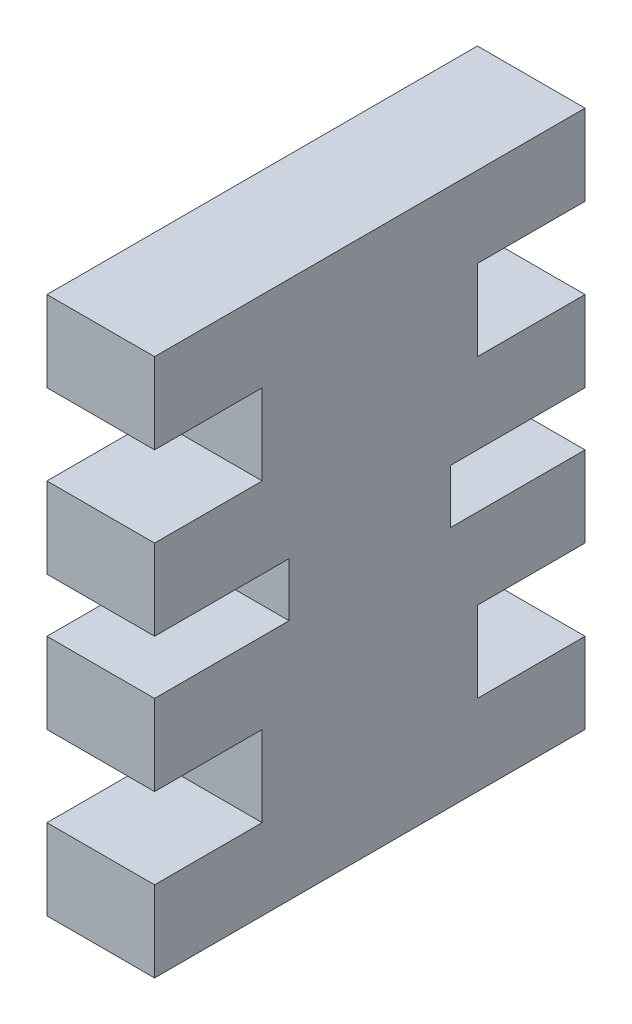
ISO-10303-21;
HEADER;
FILE_DESCRIPTION(('STEP AP214'),'2;1');
FILE_NAME('part.step','',(''),(''),'','','');
FILE_SCHEMA(('AUTOMOTIVE_DESIGN { 1 0 10303 214 1 1 1 1 }'));
ENDSEC;
DATA;
#1=APPLICATION_CONTEXT('core data for automotive mechanical design processes');
#2=APPLICATION_PROTOCOL_DEFINITION('international standard','automotive_design',2000,#1);
#3=PRODUCT_CONTEXT('',#1,'mechanical');
#4=PRODUCT('Part','Part','',(#3));
#5=PRODUCT_RELATED_PRODUCT_CATEGORY('part','',(#4));
#6=PRODUCT_DEFINITION_FORMATION('','',#4);
#7=PRODUCT_DEFINITION_CONTEXT('part definition',#1,'design');
#8=PRODUCT_DEFINITION('design','',#6,#7);
#9=PRODUCT_DEFINITION_SHAPE('','',#8);
#10=(LENGTH_UNIT() NAMED_UNIT(*) SI_UNIT(.MILLI.,.METRE.));
#11=(NAMED_UNIT(*) PLANE_ANGLE_UNIT() SI_UNIT($,.RADIAN.));
#12=(NAMED_UNIT(*) SI_UNIT($,.STERADIAN.) SOLID_ANGLE_UNIT());
#13=UNCERTAINTY_MEASURE_WITH_UNIT(LENGTH_MEASURE(1.E-05),#10,'distance_accuracy_value','');
#14=(GEOMETRIC_REPRESENTATION_CONTEXT(3) GLOBAL_UNCERTAINTY_ASSIGNED_CONTEXT((#13)) GLOBAL_UNIT_ASSIGNED_CONTEXT((#10,
#11,#12)) REPRESENTATION_CONTEXT('',''));
#15=CARTESIAN_POINT('',(0.,0.,0.));
#16=DIRECTION('',(0.,0.,1.));
#17=DIRECTION('',(1.,0.,0.));
#18=AXIS2_PLACEMENT_3D('',#15,#16,#17);
#19=CARTESIAN_POINT('',(-20.,0.,0.));
#20=DIRECTION('',(0.,0.,1.));
#21=DIRECTION('',(1.,0.,0.));
#22=AXIS2_PLACEMENT_3D('',#19,#20,#21);
#23=PLANE('',#22);
#24=DIRECTION('',(0.,-1.,0.));
#25=VECTOR('',#24,1.);
#26=CARTESIAN_POINT('',(0.,0.,0.));
#27=LINE('',#26,#25);
#28=CARTESIAN_POINT('',(0.,15.,0.));
#29=VERTEX_POINT('',#28);
#30=CARTESIAN_POINT('',(0.,0.,0.));
#31=VERTEX_POINT('',#30);
#32=EDGE_CURVE('E250',#29,#31,#27,.T.);
#33=ORIENTED_EDGE('',*,*,#32,.F.);
#34=DIRECTION('',(1.,0.,0.));
#35=VECTOR('',#34,1.);
#36=CARTESIAN_POINT('',(-20.,15.,0.));
#37=LINE('',#36,#35);
#38=CARTESIAN_POINT('',(-20.,15.,0.));
#39=VERTEX_POINT('',#38);
#40=EDGE_CURVE('E11',#39,#29,#37,.T.);
#41=ORIENTED_EDGE('',*,*,#40,.F.);
#42=DIRECTION('',(0.,-1.,0.));
#43=VECTOR('',#42,1.);
#44=CARTESIAN_POINT('',(-20.,0.,0.));
#45=LINE('',#44,#43);
#46=CARTESIAN_POINT('',(-20.,0.,0.));
#47=VERTEX_POINT('',#46);
#48=EDGE_CURVE('E330',#39,#47,#45,.T.);
#49=ORIENTED_EDGE('',*,*,#48,.T.);
#50=DIRECTION('',(1.,0.,0.));
#51=VECTOR('',#50,1.);
#52=CARTESIAN_POINT('',(-20.,0.,0.));
#53=LINE('',#52,#51);
#54=EDGE_CURVE('E36',#47,#31,#53,.T.);
#55=ORIENTED_EDGE('',*,*,#54,.T.);
#56=EDGE_LOOP('',(#33,#41,#49,#55));
#57=FACE_BOUND('',#56,.T.);
#58=ADVANCED_FACE('F33',(#57),#23,.T.);
#59=CARTESIAN_POINT('',(-20.,15.,0.));
#60=DIRECTION('',(0.,1.,0.));
#61=DIRECTION('',(0.,0.,1.));
#62=AXIS2_PLACEMENT_3D('',#59,#60,#61);
#63=PLANE('',#62);
#64=DIRECTION('',(0.,0.,1.));
#65=VECTOR('',#64,1.);
#66=CARTESIAN_POINT('',(0.,15.,0.));
#67=LINE('',#66,#65);
#68=CARTESIAN_POINT('',(0.,15.,-20.));
#69=VERTEX_POINT('',#68);
#70=EDGE_CURVE('E328',#69,#29,#67,.T.);
#71=ORIENTED_EDGE('',*,*,#70,.F.);
#72=DIRECTION('',(1.,0.,0.));
#73=VECTOR('',#72,1.);
#74=CARTESIAN_POINT('',(-20.,15.,-20.));
#75=LINE('',#74,#73);
#76=CARTESIAN_POINT('',(-20.,15.,-20.));
#77=VERTEX_POINT('',#76);
#78=EDGE_CURVE('E42',#77,#69,#75,.T.);
#79=ORIENTED_EDGE('',*,*,#78,.F.);
#80=DIRECTION('',(0.,0.,1.));
#81=VECTOR('',#80,1.);
#82=CARTESIAN_POINT('',(-20.,15.,0.));
#83=LINE('',#82,#81);
#84=EDGE_CURVE('E240',#77,#39,#83,.T.);
#85=ORIENTED_EDGE('',*,*,#84,.T.);
#86=ORIENTED_EDGE('',*,*,#40,.T.);
#87=EDGE_LOOP('',(#71,#79,#85,#86));
#88=FACE_BOUND('',#87,.T.);
#89=ADVANCED_FACE('F382',(#88),#63,.T.);
#90=CARTESIAN_POINT('',(-20.,15.,-20.));
#91=DIRECTION('',(0.,0.,1.));
#92=DIRECTION('',(1.,0.,0.));
#93=AXIS2_PLACEMENT_3D('',#90,#91,#92);
#94=PLANE('',#93);
#95=DIRECTION('',(0.,-1.,0.));
#96=VECTOR('',#95,1.);
#97=CARTESIAN_POINT('',(0.,15.,-20.));
#98=LINE('',#97,#96);
#99=CARTESIAN_POINT('',(0.,30.,-20.));
#100=VERTEX_POINT('',#99);
#101=EDGE_CURVE('E227',#100,#69,#98,.T.);
#102=ORIENTED_EDGE('',*,*,#101,.F.);
#103=DIRECTION('',(1.,0.,0.));
#104=VECTOR('',#103,1.);
#105=CARTESIAN_POINT('',(-20.,30.,-20.));
#106=LINE('',#105,#104);
#107=CARTESIAN_POINT('',(-20.,30.,-20.));
#108=VERTEX_POINT('',#107);
#109=EDGE_CURVE('E222',#108,#100,#106,.T.);
#110=ORIENTED_EDGE('',*,*,#109,.F.);
#111=DIRECTION('',(0.,-1.,0.));
#112=VECTOR('',#111,1.);
#113=CARTESIAN_POINT('',(-20.,15.,-20.));
#114=LINE('',#113,#112);
#115=EDGE_CURVE('E225',#108,#77,#114,.T.);
#116=ORIENTED_EDGE('',*,*,#115,.T.);
#117=ORIENTED_EDGE('',*,*,#78,.T.);
#118=EDGE_LOOP('',(#102,#110,#116,#117));
#119=FACE_BOUND('',#118,.T.);
#120=ADVANCED_FACE('F224',(#119),#94,.T.);
#121=CARTESIAN_POINT('',(-20.,30.,-20.));
#122=DIRECTION('',(0.,-1.,0.));
#123=DIRECTION('',(0.,0.,-1.));
#124=AXIS2_PLACEMENT_3D('',#121,#122,#123);
#125=PLANE('',#124);
#126=DIRECTION('',(0.,0.,-1.));
#127=VECTOR('',#126,1.);
#128=CARTESIAN_POINT('',(0.,30.,-20.));
#129=LINE('',#128,#127);
#130=CARTESIAN_POINT('',(0.,30.,0.));
#131=VERTEX_POINT('',#130);
#132=EDGE_CURVE('E325',#131,#100,#129,.T.);
#133=ORIENTED_EDGE('',*,*,#132,.F.);
#134=DIRECTION('',(1.,0.,0.));
#135=VECTOR('',#134,1.);
#136=CARTESIAN_POINT('',(-20.,30.,0.));
#137=LINE('',#136,#135);
#138=CARTESIAN_POINT('',(-20.,30.,0.));
#139=VERTEX_POINT('',#138);
#140=EDGE_CURVE('E232',#139,#131,#137,.T.);
#141=ORIENTED_EDGE('',*,*,#140,.F.);
#142=DIRECTION('',(0.,0.,-1.));
#143=VECTOR('',#142,1.);
#144=CARTESIAN_POINT('',(-20.,30.,-20.));
#145=LINE('',#144,#143);
#146=EDGE_CURVE('E238',#139,#108,#145,.T.);
#147=ORIENTED_EDGE('',*,*,#146,.T.);
#148=ORIENTED_EDGE('',*,*,#109,.T.);
#149=EDGE_LOOP('',(#133,#141,#147,#148));
#150=FACE_BOUND('',#149,.T.);
#151=ADVANCED_FACE('F242',(#150),#125,.T.);
#152=CARTESIAN_POINT('',(-20.,30.,0.));
#153=DIRECTION('',(0.,0.,1.));
#154=DIRECTION('',(1.,0.,0.));
#155=AXIS2_PLACEMENT_3D('',#152,#153,#154);
#156=PLANE('',#155);
#157=DIRECTION('',(0.,-1.,0.));
#158=VECTOR('',#157,1.);
#159=CARTESIAN_POINT('',(0.,30.,0.));
#160=LINE('',#159,#158);
#161=CARTESIAN_POINT('',(0.,45.,0.));
#162=VERTEX_POINT('',#161);
#163=EDGE_CURVE('E322',#162,#131,#160,.T.);
#164=ORIENTED_EDGE('',*,*,#163,.F.);
#165=DIRECTION('',(1.,0.,0.));
#166=VECTOR('',#165,1.);
#167=CARTESIAN_POINT('',(-20.,45.,0.));
#168=LINE('',#167,#166);
#169=CARTESIAN_POINT('',(-20.,45.,0.));
#170=VERTEX_POINT('',#169);
#171=EDGE_CURVE('E334',#170,#162,#168,.T.);
#172=ORIENTED_EDGE('',*,*,#171,.F.);
#173=DIRECTION('',(0.,-1.,0.));
#174=VECTOR('',#173,1.);
#175=CARTESIAN_POINT('',(-20.,30.,0.));
#176=LINE('',#175,#174);
#177=EDGE_CURVE('E243',#170,#139,#176,.T.);
#178=ORIENTED_EDGE('',*,*,#177,.T.);
#179=ORIENTED_EDGE('',*,*,#140,.T.);
#180=EDGE_LOOP('',(#164,#172,#178,#179));
#181=FACE_BOUND('',#180,.T.);
#182=ADVANCED_FACE('F395',(#181),#156,.T.);
#183=CARTESIAN_POINT('',(-20.,45.,0.));
#184=DIRECTION('',(0.,1.,0.));
#185=DIRECTION('',(0.,0.,1.));
#186=AXIS2_PLACEMENT_3D('',#183,#184,#185);
#187=PLANE('',#186);
#188=DIRECTION('',(0.,0.,1.));
#189=VECTOR('',#188,1.);
#190=CARTESIAN_POINT('',(0.,45.,0.));
#191=LINE('',#190,#189);
#192=CARTESIAN_POINT('',(0.,45.,-25.));
#193=VERTEX_POINT('',#192);
#194=EDGE_CURVE('E319',#193,#162,#191,.T.);
#195=ORIENTED_EDGE('',*,*,#194,.F.);
#196=DIRECTION('',(1.,0.,0.));
#197=VECTOR('',#196,1.);
#198=CARTESIAN_POINT('',(-20.,45.,-25.));
#199=LINE('',#198,#197);
#200=CARTESIAN_POINT('',(-20.,45.,-25.));
#201=VERTEX_POINT('',#200);
#202=EDGE_CURVE('E336',#201,#193,#199,.T.);
#203=ORIENTED_EDGE('',*,*,#202,.F.);
#204=DIRECTION('',(0.,0.,1.));
#205=VECTOR('',#204,1.);
#206=CARTESIAN_POINT('',(-20.,45.,0.));
#207=LINE('',#206,#205);
#208=EDGE_CURVE('E245',#201,#170,#207,.T.);
#209=ORIENTED_EDGE('',*,*,#208,.T.);
#210=ORIENTED_EDGE('',*,*,#171,.T.);
#211=EDGE_LOOP('',(#195,#203,#209,#210));
#212=FACE_BOUND('',#211,.T.);
#213=ADVANCED_FACE('F398',(#212),#187,.T.);
#214=CARTESIAN_POINT('',(-20.,45.,-25.));
#215=DIRECTION('',(0.,0.,1.));
#216=DIRECTION('',(1.,0.,0.));
#217=AXIS2_PLACEMENT_3D('',#214,#215,#216);
#218=PLANE('',#217);
#219=DIRECTION('',(0.,-1.,0.));
#220=VECTOR('',#219,1.);
#221=CARTESIAN_POINT('',(0.,45.,-25.));
#222=LINE('',#221,#220);
#223=CARTESIAN_POINT('',(0.,55.,-25.));
#224=VERTEX_POINT('',#223);
#225=EDGE_CURVE('E316',#224,#193,#222,.T.);
#226=ORIENTED_EDGE('',*,*,#225,.F.);
#227=DIRECTION('',(1.,0.,0.));
#228=VECTOR('',#227,1.);
#229=CARTESIAN_POINT('',(-20.,55.,-25.));
#230=LINE('',#229,#228);
#231=CARTESIAN_POINT('',(-20.,55.,-25.));
#232=VERTEX_POINT('',#231);
#233=EDGE_CURVE('E338',#232,#224,#230,.T.);
#234=ORIENTED_EDGE('',*,*,#233,.F.);
#235=DIRECTION('',(0.,-1.,0.));
#236=VECTOR('',#235,1.);
#237=CARTESIAN_POINT('',(-20.,45.,-25.));
#238=LINE('',#237,#236);
#239=EDGE_CURVE('E743',#232,#201,#238,.T.);
#240=ORIENTED_EDGE('',*,*,#239,.T.);
#241=ORIENTED_EDGE('',*,*,#202,.T.);
#242=EDGE_LOOP('',(#226,#234,#240,#241));
#243=FACE_BOUND('',#242,.T.);
#244=ADVANCED_FACE('F402',(#243),#218,.T.);
#245=CARTESIAN_POINT('',(-20.,55.,-25.));
#246=DIRECTION('',(0.,-1.,0.));
#247=DIRECTION('',(0.,0.,-1.));
#248=AXIS2_PLACEMENT_3D('',#245,#246,#247);
#249=PLANE('',#248);
#250=DIRECTION('',(0.,0.,-1.));
#251=VECTOR('',#250,1.);
#252=CARTESIAN_POINT('',(0.,55.,-25.));
#253=LINE('',#252,#251);
#254=CARTESIAN_POINT('',(0.,55.,0.));
#255=VERTEX_POINT('',#254);
#256=EDGE_CURVE('E313',#255,#224,#253,.T.);
#257=ORIENTED_EDGE('',*,*,#256,.F.);
#258=DIRECTION('',(1.,0.,0.));
#259=VECTOR('',#258,1.);
#260=CARTESIAN_POINT('',(-20.,55.,0.));
#261=LINE('',#260,#259);
#262=CARTESIAN_POINT('',(-20.,55.,0.));
#263=VERTEX_POINT('',#262);
#264=EDGE_CURVE('E340',#263,#255,#261,.T.);
#265=ORIENTED_EDGE('',*,*,#264,.F.);
#266=DIRECTION('',(0.,0.,-1.));
#267=VECTOR('',#266,1.);
#268=CARTESIAN_POINT('',(-20.,55.,-25.));
#269=LINE('',#268,#267);
#270=EDGE_CURVE('E739',#263,#232,#269,.T.);
#271=ORIENTED_EDGE('',*,*,#270,.T.);
#272=ORIENTED_EDGE('',*,*,#233,.T.);
#273=EDGE_LOOP('',(#257,#265,#271,#272));
#274=FACE_BOUND('',#273,.T.);
#275=ADVANCED_FACE('F406',(#274),#249,.T.);
#276=CARTESIAN_POINT('',(-20.,55.,0.));
#277=DIRECTION('',(0.,0.,1.));
#278=DIRECTION('',(1.,0.,0.));
#279=AXIS2_PLACEMENT_3D('',#276,#277,#278);
#280=PLANE('',#279);
#281=DIRECTION('',(0.,-1.,0.));
#282=VECTOR('',#281,1.);
#283=CARTESIAN_POINT('',(0.,55.,0.));
#284=LINE('',#283,#282);
#285=CARTESIAN_POINT('',(0.,70.,0.));
#286=VERTEX_POINT('',#285);
#287=EDGE_CURVE('E310',#286,#255,#284,.T.);
#288=ORIENTED_EDGE('',*,*,#287,.F.);
#289=DIRECTION('',(1.,0.,0.));
#290=VECTOR('',#289,1.);
#291=CARTESIAN_POINT('',(-20.,70.,0.));
#292=LINE('',#291,#290);
#293=CARTESIAN_POINT('',(-20.,70.,0.));
#294=VERTEX_POINT('',#293);
#295=EDGE_CURVE('E342',#294,#286,#292,.T.);
#296=ORIENTED_EDGE('',*,*,#295,.F.);
#297=DIRECTION('',(0.,-1.,0.));
#298=VECTOR('',#297,1.);
#299=CARTESIAN_POINT('',(-20.,55.,0.));
#300=LINE('',#299,#298);
#301=EDGE_CURVE('E750',#294,#263,#300,.T.);
#302=ORIENTED_EDGE('',*,*,#301,.T.);
#303=ORIENTED_EDGE('',*,*,#264,.T.);
#304=EDGE_LOOP('',(#288,#296,#302,#303));
#305=FACE_BOUND('',#304,.T.);
#306=ADVANCED_FACE('F410',(#305),#280,.T.);
#307=CARTESIAN_POINT('',(-20.,70.,0.));
#308=DIRECTION('',(0.,1.,0.));
#309=DIRECTION('',(0.,0.,1.));
#310=AXIS2_PLACEMENT_3D('',#307,#308,#309);
#311=PLANE('',#310);
#312=DIRECTION('',(0.,0.,1.));
#313=VECTOR('',#312,1.);
#314=CARTESIAN_POINT('',(0.,70.,0.));
#315=LINE('',#314,#313);
#316=CARTESIAN_POINT('',(0.,70.,-20.));
#317=VERTEX_POINT('',#316);
#318=EDGE_CURVE('E307',#317,#286,#315,.T.);
#319=ORIENTED_EDGE('',*,*,#318,.F.);
#320=DIRECTION('',(1.,0.,0.));
#321=VECTOR('',#320,1.);
#322=CARTESIAN_POINT('',(-20.,70.,-20.));
#323=LINE('',#322,#321);
#324=CARTESIAN_POINT('',(-20.,70.,-20.));
#325=VERTEX_POINT('',#324);
#326=EDGE_CURVE('E344',#325,#317,#323,.T.);
#327=ORIENTED_EDGE('',*,*,#326,.F.);
#328=DIRECTION('',(0.,0.,1.));
#329=VECTOR('',#328,1.);
#330=CARTESIAN_POINT('',(-20.,70.,0.));
#331=LINE('',#330,#329);
#332=EDGE_CURVE('E732',#325,#294,#331,.T.);
#333=ORIENTED_EDGE('',*,*,#332,.T.);
#334=ORIENTED_EDGE('',*,*,#295,.T.);
#335=EDGE_LOOP('',(#319,#327,#333,#334));
#336=FACE_BOUND('',#335,.T.);
#337=ADVANCED_FACE('F414',(#336),#311,.T.);
#338=CARTESIAN_POINT('',(-20.,70.,-20.));
#339=DIRECTION('',(0.,0.,1.));
#340=DIRECTION('',(1.,0.,0.));
#341=AXIS2_PLACEMENT_3D('',#338,#339,#340);
#342=PLANE('',#341);
#343=DIRECTION('',(0.,-1.,0.));
#344=VECTOR('',#343,1.);
#345=CARTESIAN_POINT('',(0.,70.,-20.));
#346=LINE('',#345,#344);
#347=CARTESIAN_POINT('',(0.,85.,-20.));
#348=VERTEX_POINT('',#347);
#349=EDGE_CURVE('E304',#348,#317,#346,.T.);
#350=ORIENTED_EDGE('',*,*,#349,.F.);
#351=DIRECTION('',(1.,0.,0.));
#352=VECTOR('',#351,1.);
#353=CARTESIAN_POINT('',(-20.,85.,-20.));
#354=LINE('',#353,#352);
#355=CARTESIAN_POINT('',(-20.,85.,-20.));
#356=VERTEX_POINT('',#355);
#357=EDGE_CURVE('E346',#356,#348,#354,.T.);
#358=ORIENTED_EDGE('',*,*,#357,.F.);
#359=DIRECTION('',(0.,-1.,0.));
#360=VECTOR('',#359,1.);
#361=CARTESIAN_POINT('',(-20.,70.,-20.));
#362=LINE('',#361,#360);
#363=EDGE_CURVE('E728',#356,#325,#362,.T.);
#364=ORIENTED_EDGE('',*,*,#363,.T.);
#365=ORIENTED_EDGE('',*,*,#326,.T.);
#366=EDGE_LOOP('',(#350,#358,#364,#365));
#367=FACE_BOUND('',#366,.T.);
#368=ADVANCED_FACE('F418',(#367),#342,.T.);
#369=CARTESIAN_POINT('',(-20.,85.,-20.));
#370=DIRECTION('',(0.,-1.,0.));
#371=DIRECTION('',(0.,0.,-1.));
#372=AXIS2_PLACEMENT_3D('',#369,#370,#371);
#373=PLANE('',#372);
#374=DIRECTION('',(0.,0.,-1.));
#375=VECTOR('',#374,1.);
#376=CARTESIAN_POINT('',(0.,85.,-20.));
#377=LINE('',#376,#375);
#378=CARTESIAN_POINT('',(0.,85.,0.));
#379=VERTEX_POINT('',#378);
#380=EDGE_CURVE('E301',#379,#348,#377,.T.);
#381=ORIENTED_EDGE('',*,*,#380,.F.);
#382=DIRECTION('',(1.,0.,0.));
#383=VECTOR('',#382,1.);
#384=CARTESIAN_POINT('',(-20.,85.,0.));
#385=LINE('',#384,#383);
#386=CARTESIAN_POINT('',(-20.,85.,0.));
#387=VERTEX_POINT('',#386);
#388=EDGE_CURVE('E348',#387,#379,#385,.T.);
#389=ORIENTED_EDGE('',*,*,#388,.F.);
#390=DIRECTION('',(0.,0.,-1.));
#391=VECTOR('',#390,1.);
#392=CARTESIAN_POINT('',(-20.,85.,-20.));
#393=LINE('',#392,#391);
#394=EDGE_CURVE('E754',#387,#356,#393,.T.);
#395=ORIENTED_EDGE('',*,*,#394,.T.);
#396=ORIENTED_EDGE('',*,*,#357,.T.);
#397=EDGE_LOOP('',(#381,#389,#395,#396));
#398=FACE_BOUND('',#397,.T.);
#399=ADVANCED_FACE('F422',(#398),#373,.T.);
#400=CARTESIAN_POINT('',(-20.,85.,0.));
#401=DIRECTION('',(0.,0.,1.));
#402=DIRECTION('',(1.,0.,0.));
#403=AXIS2_PLACEMENT_3D('',#400,#401,#402);
#404=PLANE('',#403);
#405=DIRECTION('',(0.,-1.,0.));
#406=VECTOR('',#405,1.);
#407=CARTESIAN_POINT('',(0.,85.,0.));
#408=LINE('',#407,#406);
#409=CARTESIAN_POINT('',(0.,100.,0.));
#410=VERTEX_POINT('',#409);
#411=EDGE_CURVE('E298',#410,#379,#408,.T.);
#412=ORIENTED_EDGE('',*,*,#411,.F.);
#413=DIRECTION('',(1.,0.,0.));
#414=VECTOR('',#413,1.);
#415=CARTESIAN_POINT('',(-20.,100.,0.));
#416=LINE('',#415,#414);
#417=CARTESIAN_POINT('',(-20.,100.,0.));
#418=VERTEX_POINT('',#417);
#419=EDGE_CURVE('E350',#418,#410,#416,.T.);
#420=ORIENTED_EDGE('',*,*,#419,.F.);
#421=DIRECTION('',(0.,-1.,0.));
#422=VECTOR('',#421,1.);
#423=CARTESIAN_POINT('',(-20.,85.,0.));
#424=LINE('',#423,#422);
#425=EDGE_CURVE('E721',#418,#387,#424,.T.);
#426=ORIENTED_EDGE('',*,*,#425,.T.);
#427=ORIENTED_EDGE('',*,*,#388,.T.);
#428=EDGE_LOOP('',(#412,#420,#426,#427));
#429=FACE_BOUND('',#428,.T.);
#430=ADVANCED_FACE('F426',(#429),#404,.T.);
#431=CARTESIAN_POINT('',(-20.,100.,-80.));
#432=DIRECTION('',(0.,1.,0.));
#433=DIRECTION('',(0.,0.,1.));
#434=AXIS2_PLACEMENT_3D('',#431,#432,#433);
#435=PLANE('',#434);
#436=DIRECTION('',(0.,0.,1.));
#437=VECTOR('',#436,1.);
#438=CARTESIAN_POINT('',(0.,100.,-80.));
#439=LINE('',#438,#437);
#440=CARTESIAN_POINT('',(0.,100.,-80.));
#441=VERTEX_POINT('',#440);
#442=EDGE_CURVE('E295',#441,#410,#439,.T.);
#443=ORIENTED_EDGE('',*,*,#442,.F.);
#444=DIRECTION('',(1.,0.,0.));
#445=VECTOR('',#444,1.);
#446=CARTESIAN_POINT('',(-20.,100.,-80.));
#447=LINE('',#446,#445);
#448=CARTESIAN_POINT('',(-20.,100.,-80.));
#449=VERTEX_POINT('',#448);
#450=EDGE_CURVE('E352',#449,#441,#447,.T.);
#451=ORIENTED_EDGE('',*,*,#450,.F.);
#452=DIRECTION('',(0.,0.,1.));
#453=VECTOR('',#452,1.);
#454=CARTESIAN_POINT('',(-20.,100.,-80.));
#455=LINE('',#454,#453);
#456=EDGE_CURVE('E717',#449,#418,#455,.T.);
#457=ORIENTED_EDGE('',*,*,#456,.T.);
#458=ORIENTED_EDGE('',*,*,#419,.T.);
#459=EDGE_LOOP('',(#443,#451,#457,#458));
#460=FACE_BOUND('',#459,.T.);
#461=ADVANCED_FACE('F430',(#460),#435,.T.);
#462=CARTESIAN_POINT('',(-20.,85.,-80.));
#463=DIRECTION('',(0.,0.,-1.));
#464=DIRECTION('',(-1.,0.,0.));
#465=AXIS2_PLACEMENT_3D('',#462,#463,#464);
#466=PLANE('',#465);
#467=DIRECTION('',(0.,1.,0.));
#468=VECTOR('',#467,1.);
#469=CARTESIAN_POINT('',(0.,85.,-80.));
#470=LINE('',#469,#468);
#471=CARTESIAN_POINT('',(0.,85.,-80.));
#472=VERTEX_POINT('',#471);
#473=EDGE_CURVE('E292',#472,#441,#470,.T.);
#474=ORIENTED_EDGE('',*,*,#473,.F.);
#475=DIRECTION('',(1.,0.,0.));
#476=VECTOR('',#475,1.);
#477=CARTESIAN_POINT('',(-20.,85.,-80.));
#478=LINE('',#477,#476);
#479=CARTESIAN_POINT('',(-20.,85.,-80.));
#480=VERTEX_POINT('',#479);
#481=EDGE_CURVE('E354',#480,#472,#478,.T.);
#482=ORIENTED_EDGE('',*,*,#481,.F.);
#483=DIRECTION('',(0.,1.,0.));
#484=VECTOR('',#483,1.);
#485=CARTESIAN_POINT('',(-20.,85.,-80.));
#486=LINE('',#485,#484);
#487=EDGE_CURVE('E758',#480,#449,#486,.T.);
#488=ORIENTED_EDGE('',*,*,#487,.T.);
#489=ORIENTED_EDGE('',*,*,#450,.T.);
#490=EDGE_LOOP('',(#474,#482,#488,#489));
#491=FACE_BOUND('',#490,.T.);
#492=ADVANCED_FACE('F434',(#491),#466,.T.);
#493=CARTESIAN_POINT('',(-20.,85.,-60.));
#494=DIRECTION('',(0.,-1.,0.));
#495=DIRECTION('',(0.,0.,-1.));
#496=AXIS2_PLACEMENT_3D('',#493,#494,#495);
#497=PLANE('',#496);
#498=DIRECTION('',(0.,0.,-1.));
#499=VECTOR('',#498,1.);
#500=CARTESIAN_POINT('',(0.,85.,-60.));
#501=LINE('',#500,#499);
#502=CARTESIAN_POINT('',(0.,85.,-60.));
#503=VERTEX_POINT('',#502);
#504=EDGE_CURVE('E289',#503,#472,#501,.T.);
#505=ORIENTED_EDGE('',*,*,#504,.F.);
#506=DIRECTION('',(1.,0.,0.));
#507=VECTOR('',#506,1.);
#508=CARTESIAN_POINT('',(-20.,85.,-60.));
#509=LINE('',#508,#507);
#510=CARTESIAN_POINT('',(-20.,85.,-60.));
#511=VERTEX_POINT('',#510);
#512=EDGE_CURVE('E356',#511,#503,#509,.T.);
#513=ORIENTED_EDGE('',*,*,#512,.F.);
#514=DIRECTION('',(0.,0.,-1.));
#515=VECTOR('',#514,1.);
#516=CARTESIAN_POINT('',(-20.,85.,-60.));
#517=LINE('',#516,#515);
#518=EDGE_CURVE('E710',#511,#480,#517,.T.);
#519=ORIENTED_EDGE('',*,*,#518,.T.);
#520=ORIENTED_EDGE('',*,*,#481,.T.);
#521=EDGE_LOOP('',(#505,#513,#519,#520));
#522=FACE_BOUND('',#521,.T.);
#523=ADVANCED_FACE('F438',(#522),#497,.T.);
#524=CARTESIAN_POINT('',(-20.,70.,-60.));
#525=DIRECTION('',(0.,0.,-1.));
#526=DIRECTION('',(-1.,0.,0.));
#527=AXIS2_PLACEMENT_3D('',#524,#525,#526);
#528=PLANE('',#527);
#529=DIRECTION('',(0.,1.,0.));
#530=VECTOR('',#529,1.);
#531=CARTESIAN_POINT('',(0.,70.,-60.));
#532=LINE('',#531,#530);
#533=CARTESIAN_POINT('',(0.,70.,-60.));
#534=VERTEX_POINT('',#533);
#535=EDGE_CURVE('E286',#534,#503,#532,.T.);
#536=ORIENTED_EDGE('',*,*,#535,.F.);
#537=DIRECTION('',(1.,0.,0.));
#538=VECTOR('',#537,1.);
#539=CARTESIAN_POINT('',(-20.,70.,-60.));
#540=LINE('',#539,#538);
#541=CARTESIAN_POINT('',(-20.,70.,-60.));
#542=VERTEX_POINT('',#541);
#543=EDGE_CURVE('E358',#542,#534,#540,.T.);
#544=ORIENTED_EDGE('',*,*,#543,.F.);
#545=DIRECTION('',(0.,1.,0.));
#546=VECTOR('',#545,1.);
#547=CARTESIAN_POINT('',(-20.,70.,-60.));
#548=LINE('',#547,#546);
#549=EDGE_CURVE('E706',#542,#511,#548,.T.);
#550=ORIENTED_EDGE('',*,*,#549,.T.);
#551=ORIENTED_EDGE('',*,*,#512,.T.);
#552=EDGE_LOOP('',(#536,#544,#550,#551));
#553=FACE_BOUND('',#552,.T.);
#554=ADVANCED_FACE('F442',(#553),#528,.T.);
#555=CARTESIAN_POINT('',(-20.,70.,-80.));
#556=DIRECTION('',(0.,1.,0.));
#557=DIRECTION('',(0.,0.,1.));
#558=AXIS2_PLACEMENT_3D('',#555,#556,#557);
#559=PLANE('',#558);
#560=DIRECTION('',(0.,0.,1.));
#561=VECTOR('',#560,1.);
#562=CARTESIAN_POINT('',(0.,70.,-80.));
#563=LINE('',#562,#561);
#564=CARTESIAN_POINT('',(0.,70.,-80.));
#565=VERTEX_POINT('',#564);
#566=EDGE_CURVE('E283',#565,#534,#563,.T.);
#567=ORIENTED_EDGE('',*,*,#566,.F.);
#568=DIRECTION('',(1.,0.,0.));
#569=VECTOR('',#568,1.);
#570=CARTESIAN_POINT('',(-20.,70.,-80.));
#571=LINE('',#570,#569);
#572=CARTESIAN_POINT('',(-20.,70.,-80.));
#573=VERTEX_POINT('',#572);
#574=EDGE_CURVE('E360',#573,#565,#571,.T.);
#575=ORIENTED_EDGE('',*,*,#574,.F.);
#576=DIRECTION('',(0.,0.,1.));
#577=VECTOR('',#576,1.);
#578=CARTESIAN_POINT('',(-20.,70.,-80.));
#579=LINE('',#578,#577);
#580=EDGE_CURVE('E762',#573,#542,#579,.T.);
#581=ORIENTED_EDGE('',*,*,#580,.T.);
#582=ORIENTED_EDGE('',*,*,#543,.T.);
#583=EDGE_LOOP('',(#567,#575,#581,#582));
#584=FACE_BOUND('',#583,.T.);
#585=ADVANCED_FACE('F446',(#584),#559,.T.);
#586=CARTESIAN_POINT('',(-20.,55.,-80.));
#587=DIRECTION('',(0.,0.,-1.));
#588=DIRECTION('',(-1.,0.,0.));
#589=AXIS2_PLACEMENT_3D('',#586,#587,#588);
#590=PLANE('',#589);
#591=DIRECTION('',(0.,1.,0.));
#592=VECTOR('',#591,1.);
#593=CARTESIAN_POINT('',(0.,55.,-80.));
#594=LINE('',#593,#592);
#595=CARTESIAN_POINT('',(0.,55.,-80.));
#596=VERTEX_POINT('',#595);
#597=EDGE_CURVE('E280',#596,#565,#594,.T.);
#598=ORIENTED_EDGE('',*,*,#597,.F.);
#599=DIRECTION('',(1.,0.,0.));
#600=VECTOR('',#599,1.);
#601=CARTESIAN_POINT('',(-20.,55.,-80.));
#602=LINE('',#601,#600);
#603=CARTESIAN_POINT('',(-20.,55.,-80.));
#604=VERTEX_POINT('',#603);
#605=EDGE_CURVE('E362',#604,#596,#602,.T.);
#606=ORIENTED_EDGE('',*,*,#605,.F.);
#607=DIRECTION('',(0.,1.,0.));
#608=VECTOR('',#607,1.);
#609=CARTESIAN_POINT('',(-20.,55.,-80.));
#610=LINE('',#609,#608);
#611=EDGE_CURVE('E699',#604,#573,#610,.T.);
#612=ORIENTED_EDGE('',*,*,#611,.T.);
#613=ORIENTED_EDGE('',*,*,#574,.T.);
#614=EDGE_LOOP('',(#598,#606,#612,#613));
#615=FACE_BOUND('',#614,.T.);
#616=ADVANCED_FACE('F450',(#615),#590,.T.);
#617=CARTESIAN_POINT('',(-20.,55.,-55.));
#618=DIRECTION('',(0.,-1.,0.));
#619=DIRECTION('',(0.,0.,-1.));
#620=AXIS2_PLACEMENT_3D('',#617,#618,#619);
#621=PLANE('',#620);
#622=DIRECTION('',(0.,0.,-1.));
#623=VECTOR('',#622,1.);
#624=CARTESIAN_POINT('',(0.,55.,-55.));
#625=LINE('',#624,#623);
#626=CARTESIAN_POINT('',(0.,55.,-55.));
#627=VERTEX_POINT('',#626);
#628=EDGE_CURVE('E277',#627,#596,#625,.T.);
#629=ORIENTED_EDGE('',*,*,#628,.F.);
#630=DIRECTION('',(1.,0.,0.));
#631=VECTOR('',#630,1.);
#632=CARTESIAN_POINT('',(-20.,55.,-55.));
#633=LINE('',#632,#631);
#634=CARTESIAN_POINT('',(-20.,55.,-55.));
#635=VERTEX_POINT('',#634);
#636=EDGE_CURVE('E364',#635,#627,#633,.T.);
#637=ORIENTED_EDGE('',*,*,#636,.F.);
#638=DIRECTION('',(0.,0.,-1.));
#639=VECTOR('',#638,1.);
#640=CARTESIAN_POINT('',(-20.,55.,-55.));
#641=LINE('',#640,#639);
#642=EDGE_CURVE('E695',#635,#604,#641,.T.);
#643=ORIENTED_EDGE('',*,*,#642,.T.);
#644=ORIENTED_EDGE('',*,*,#605,.T.);
#645=EDGE_LOOP('',(#629,#637,#643,#644));
#646=FACE_BOUND('',#645,.T.);
#647=ADVANCED_FACE('F454',(#646),#621,.T.);
#648=CARTESIAN_POINT('',(-20.,45.,-55.));
#649=DIRECTION('',(0.,0.,-1.));
#650=DIRECTION('',(-1.,0.,0.));
#651=AXIS2_PLACEMENT_3D('',#648,#649,#650);
#652=PLANE('',#651);
#653=DIRECTION('',(0.,1.,0.));
#654=VECTOR('',#653,1.);
#655=CARTESIAN_POINT('',(0.,45.,-55.));
#656=LINE('',#655,#654);
#657=CARTESIAN_POINT('',(0.,45.,-55.));
#658=VERTEX_POINT('',#657);
#659=EDGE_CURVE('E274',#658,#627,#656,.T.);
#660=ORIENTED_EDGE('',*,*,#659,.F.);
#661=DIRECTION('',(1.,0.,0.));
#662=VECTOR('',#661,1.);
#663=CARTESIAN_POINT('',(-20.,45.,-55.));
#664=LINE('',#663,#662);
#665=CARTESIAN_POINT('',(-20.,45.,-55.));
#666=VERTEX_POINT('',#665);
#667=EDGE_CURVE('E366',#666,#658,#664,.T.);
#668=ORIENTED_EDGE('',*,*,#667,.F.);
#669=DIRECTION('',(0.,1.,0.));
#670=VECTOR('',#669,1.);
#671=CARTESIAN_POINT('',(-20.,45.,-55.));
#672=LINE('',#671,#670);
#673=EDGE_CURVE('E766',#666,#635,#672,.T.);
#674=ORIENTED_EDGE('',*,*,#673,.T.);
#675=ORIENTED_EDGE('',*,*,#636,.T.);
#676=EDGE_LOOP('',(#660,#668,#674,#675));
#677=FACE_BOUND('',#676,.T.);
#678=ADVANCED_FACE('F458',(#677),#652,.T.);
#679=CARTESIAN_POINT('',(-20.,45.,-80.));
#680=DIRECTION('',(0.,1.,0.));
#681=DIRECTION('',(0.,0.,1.));
#682=AXIS2_PLACEMENT_3D('',#679,#680,#681);
#683=PLANE('',#682);
#684=DIRECTION('',(0.,0.,1.));
#685=VECTOR('',#684,1.);
#686=CARTESIAN_POINT('',(0.,45.,-80.));
#687=LINE('',#686,#685);
#688=CARTESIAN_POINT('',(0.,45.,-80.));
#689=VERTEX_POINT('',#688);
#690=EDGE_CURVE('E271',#689,#658,#687,.T.);
#691=ORIENTED_EDGE('',*,*,#690,.F.);
#692=DIRECTION('',(1.,0.,0.));
#693=VECTOR('',#692,1.);
#694=CARTESIAN_POINT('',(-20.,45.,-80.));
#695=LINE('',#694,#693);
#696=CARTESIAN_POINT('',(-20.,45.,-80.));
#697=VERTEX_POINT('',#696);
#698=EDGE_CURVE('E368',#697,#689,#695,.T.);
#699=ORIENTED_EDGE('',*,*,#698,.F.);
#700=DIRECTION('',(0.,0.,1.));
#701=VECTOR('',#700,1.);
#702=CARTESIAN_POINT('',(-20.,45.,-80.));
#703=LINE('',#702,#701);
#704=EDGE_CURVE('E688',#697,#666,#703,.T.);
#705=ORIENTED_EDGE('',*,*,#704,.T.);
#706=ORIENTED_EDGE('',*,*,#667,.T.);
#707=EDGE_LOOP('',(#691,#699,#705,#706));
#708=FACE_BOUND('',#707,.T.);
#709=ADVANCED_FACE('F462',(#708),#683,.T.);
#710=CARTESIAN_POINT('',(-20.,30.,-80.));
#711=DIRECTION('',(0.,0.,-1.));
#712=DIRECTION('',(-1.,0.,0.));
#713=AXIS2_PLACEMENT_3D('',#710,#711,#712);
#714=PLANE('',#713);
#715=DIRECTION('',(0.,1.,0.));
#716=VECTOR('',#715,1.);
#717=CARTESIAN_POINT('',(0.,30.,-80.));
#718=LINE('',#717,#716);
#719=CARTESIAN_POINT('',(0.,30.,-80.));
#720=VERTEX_POINT('',#719);
#721=EDGE_CURVE('E268',#720,#689,#718,.T.);
#722=ORIENTED_EDGE('',*,*,#721,.F.);
#723=DIRECTION('',(1.,0.,0.));
#724=VECTOR('',#723,1.);
#725=CARTESIAN_POINT('',(-20.,30.,-80.));
#726=LINE('',#725,#724);
#727=CARTESIAN_POINT('',(-20.,30.,-80.));
#728=VERTEX_POINT('',#727);
#729=EDGE_CURVE('E370',#728,#720,#726,.T.);
#730=ORIENTED_EDGE('',*,*,#729,.F.);
#731=DIRECTION('',(0.,1.,0.));
#732=VECTOR('',#731,1.);
#733=CARTESIAN_POINT('',(-20.,30.,-80.));
#734=LINE('',#733,#732);
#735=EDGE_CURVE('E684',#728,#697,#734,.T.);
#736=ORIENTED_EDGE('',*,*,#735,.T.);
#737=ORIENTED_EDGE('',*,*,#698,.T.);
#738=EDGE_LOOP('',(#722,#730,#736,#737));
#739=FACE_BOUND('',#738,.T.);
#740=ADVANCED_FACE('F466',(#739),#714,.T.);
#741=CARTESIAN_POINT('',(-20.,30.,-60.));
#742=DIRECTION('',(0.,-1.,0.));
#743=DIRECTION('',(0.,0.,-1.));
#744=AXIS2_PLACEMENT_3D('',#741,#742,#743);
#745=PLANE('',#744);
#746=DIRECTION('',(0.,0.,-1.));
#747=VECTOR('',#746,1.);
#748=CARTESIAN_POINT('',(0.,30.,-60.));
#749=LINE('',#748,#747);
#750=CARTESIAN_POINT('',(0.,30.,-60.));
#751=VERTEX_POINT('',#750);
#752=EDGE_CURVE('E265',#751,#720,#749,.T.);
#753=ORIENTED_EDGE('',*,*,#752,.F.);
#754=DIRECTION('',(1.,0.,0.));
#755=VECTOR('',#754,1.);
#756=CARTESIAN_POINT('',(-20.,30.,-60.));
#757=LINE('',#756,#755);
#758=CARTESIAN_POINT('',(-20.,30.,-60.));
#759=VERTEX_POINT('',#758);
#760=EDGE_CURVE('E372',#759,#751,#757,.T.);
#761=ORIENTED_EDGE('',*,*,#760,.F.);
#762=DIRECTION('',(0.,0.,-1.));
#763=VECTOR('',#762,1.);
#764=CARTESIAN_POINT('',(-20.,30.,-60.));
#765=LINE('',#764,#763);
#766=EDGE_CURVE('E770',#759,#728,#765,.T.);
#767=ORIENTED_EDGE('',*,*,#766,.T.);
#768=ORIENTED_EDGE('',*,*,#729,.T.);
#769=EDGE_LOOP('',(#753,#761,#767,#768));
#770=FACE_BOUND('',#769,.T.);
#771=ADVANCED_FACE('F470',(#770),#745,.T.);
#772=CARTESIAN_POINT('',(-20.,15.,-60.));
#773=DIRECTION('',(0.,0.,-1.));
#774=DIRECTION('',(-1.,0.,0.));
#775=AXIS2_PLACEMENT_3D('',#772,#773,#774);
#776=PLANE('',#775);
#777=DIRECTION('',(0.,1.,0.));
#778=VECTOR('',#777,1.);
#779=CARTESIAN_POINT('',(0.,15.,-60.));
#780=LINE('',#779,#778);
#781=CARTESIAN_POINT('',(0.,15.,-60.));
#782=VERTEX_POINT('',#781);
#783=EDGE_CURVE('E262',#782,#751,#780,.T.);
#784=ORIENTED_EDGE('',*,*,#783,.F.);
#785=DIRECTION('',(1.,0.,0.));
#786=VECTOR('',#785,1.);
#787=CARTESIAN_POINT('',(-20.,15.,-60.));
#788=LINE('',#787,#786);
#789=CARTESIAN_POINT('',(-20.,15.,-60.));
#790=VERTEX_POINT('',#789);
#791=EDGE_CURVE('E374',#790,#782,#788,.T.);
#792=ORIENTED_EDGE('',*,*,#791,.F.);
#793=DIRECTION('',(0.,1.,0.));
#794=VECTOR('',#793,1.);
#795=CARTESIAN_POINT('',(-20.,15.,-60.));
#796=LINE('',#795,#794);
#797=EDGE_CURVE('E677',#790,#759,#796,.T.);
#798=ORIENTED_EDGE('',*,*,#797,.T.);
#799=ORIENTED_EDGE('',*,*,#760,.T.);
#800=EDGE_LOOP('',(#784,#792,#798,#799));
#801=FACE_BOUND('',#800,.T.);
#802=ADVANCED_FACE('F474',(#801),#776,.T.);
#803=CARTESIAN_POINT('',(-20.,15.,-80.));
#804=DIRECTION('',(0.,1.,0.));
#805=DIRECTION('',(0.,0.,1.));
#806=AXIS2_PLACEMENT_3D('',#803,#804,#805);
#807=PLANE('',#806);
#808=DIRECTION('',(0.,0.,1.));
#809=VECTOR('',#808,1.);
#810=CARTESIAN_POINT('',(0.,15.,-80.));
#811=LINE('',#810,#809);
#812=CARTESIAN_POINT('',(0.,15.,-80.));
#813=VERTEX_POINT('',#812);
#814=EDGE_CURVE('E259',#813,#782,#811,.T.);
#815=ORIENTED_EDGE('',*,*,#814,.F.);
#816=DIRECTION('',(1.,0.,0.));
#817=VECTOR('',#816,1.);
#818=CARTESIAN_POINT('',(-20.,15.,-80.));
#819=LINE('',#818,#817);
#820=CARTESIAN_POINT('',(-20.,15.,-80.));
#821=VERTEX_POINT('',#820);
#822=EDGE_CURVE('E376',#821,#813,#819,.T.);
#823=ORIENTED_EDGE('',*,*,#822,.F.);
#824=DIRECTION('',(0.,0.,1.));
#825=VECTOR('',#824,1.);
#826=CARTESIAN_POINT('',(-20.,15.,-80.));
#827=LINE('',#826,#825);
#828=EDGE_CURVE('E673',#821,#790,#827,.T.);
#829=ORIENTED_EDGE('',*,*,#828,.T.);
#830=ORIENTED_EDGE('',*,*,#791,.T.);
#831=EDGE_LOOP('',(#815,#823,#829,#830));
#832=FACE_BOUND('',#831,.T.);
#833=ADVANCED_FACE('F478',(#832),#807,.T.);
#834=CARTESIAN_POINT('',(-20.,0.,-80.));
#835=DIRECTION('',(0.,0.,-1.));
#836=DIRECTION('',(-1.,0.,0.));
#837=AXIS2_PLACEMENT_3D('',#834,#835,#836);
#838=PLANE('',#837);
#839=DIRECTION('',(0.,1.,0.));
#840=VECTOR('',#839,1.);
#841=CARTESIAN_POINT('',(0.,0.,-80.));
#842=LINE('',#841,#840);
#843=CARTESIAN_POINT('',(0.,0.,-80.));
#844=VERTEX_POINT('',#843);
#845=EDGE_CURVE('E256',#844,#813,#842,.T.);
#846=ORIENTED_EDGE('',*,*,#845,.F.);
#847=DIRECTION('',(1.,0.,0.));
#848=VECTOR('',#847,1.);
#849=CARTESIAN_POINT('',(-20.,0.,-80.));
#850=LINE('',#849,#848);
#851=CARTESIAN_POINT('',(-20.,0.,-80.));
#852=VERTEX_POINT('',#851);
#853=EDGE_CURVE('E377',#852,#844,#850,.T.);
#854=ORIENTED_EDGE('',*,*,#853,.F.);
#855=DIRECTION('',(0.,1.,0.));
#856=VECTOR('',#855,1.);
#857=CARTESIAN_POINT('',(-20.,0.,-80.));
#858=LINE('',#857,#856);
#859=EDGE_CURVE('E774',#852,#821,#858,.T.);
#860=ORIENTED_EDGE('',*,*,#859,.T.);
#861=ORIENTED_EDGE('',*,*,#822,.T.);
#862=EDGE_LOOP('',(#846,#854,#860,#861));
#863=FACE_BOUND('',#862,.T.);
#864=ADVANCED_FACE('F482',(#863),#838,.T.);
#865=CARTESIAN_POINT('',(-20.,0.,0.));
#866=DIRECTION('',(0.,-1.,0.));
#867=DIRECTION('',(0.,0.,-1.));
#868=AXIS2_PLACEMENT_3D('',#865,#866,#867);
#869=PLANE('',#868);
#870=DIRECTION('',(0.,0.,-1.));
#871=VECTOR('',#870,1.);
#872=CARTESIAN_POINT('',(0.,0.,0.));
#873=LINE('',#872,#871);
#874=EDGE_CURVE('E253',#31,#844,#873,.T.);
#875=ORIENTED_EDGE('',*,*,#874,.F.);
#876=ORIENTED_EDGE('',*,*,#54,.F.);
#877=DIRECTION('',(0.,0.,-1.));
#878=VECTOR('',#877,1.);
#879=CARTESIAN_POINT('',(-20.,0.,0.));
#880=LINE('',#879,#878);
#881=EDGE_CURVE('E776',#47,#852,#880,.T.);
#882=ORIENTED_EDGE('',*,*,#881,.T.);
#883=ORIENTED_EDGE('',*,*,#853,.T.);
#884=EDGE_LOOP('',(#875,#876,#882,#883));
#885=FACE_BOUND('',#884,.T.);
#886=ADVANCED_FACE('F379',(#885),#869,.T.);
#887=CARTESIAN_POINT('',(-20.,0.,0.));
#888=DIRECTION('',(-1.,0.,0.));
#889=DIRECTION('',(0.,0.,1.));
#890=AXIS2_PLACEMENT_3D('',#887,#888,#889);
#891=PLANE('',#890);
#892=ORIENTED_EDGE('',*,*,#48,.F.);
#893=ORIENTED_EDGE('',*,*,#84,.F.);
#894=ORIENTED_EDGE('',*,*,#115,.F.);
#895=ORIENTED_EDGE('',*,*,#146,.F.);
#896=ORIENTED_EDGE('',*,*,#177,.F.);
#897=ORIENTED_EDGE('',*,*,#208,.F.);
#898=ORIENTED_EDGE('',*,*,#239,.F.);
#899=ORIENTED_EDGE('',*,*,#270,.F.);
#900=ORIENTED_EDGE('',*,*,#301,.F.);
#901=ORIENTED_EDGE('',*,*,#332,.F.);
#902=ORIENTED_EDGE('',*,*,#363,.F.);
#903=ORIENTED_EDGE('',*,*,#394,.F.);
#904=ORIENTED_EDGE('',*,*,#425,.F.);
#905=ORIENTED_EDGE('',*,*,#456,.F.);
#906=ORIENTED_EDGE('',*,*,#487,.F.);
#907=ORIENTED_EDGE('',*,*,#518,.F.);
#908=ORIENTED_EDGE('',*,*,#549,.F.);
#909=ORIENTED_EDGE('',*,*,#580,.F.);
#910=ORIENTED_EDGE('',*,*,#611,.F.);
#911=ORIENTED_EDGE('',*,*,#642,.F.);
#912=ORIENTED_EDGE('',*,*,#673,.F.);
#913=ORIENTED_EDGE('',*,*,#704,.F.);
#914=ORIENTED_EDGE('',*,*,#735,.F.);
#915=ORIENTED_EDGE('',*,*,#766,.F.);
#916=ORIENTED_EDGE('',*,*,#797,.F.);
#917=ORIENTED_EDGE('',*,*,#828,.F.);
#918=ORIENTED_EDGE('',*,*,#859,.F.);
#919=ORIENTED_EDGE('',*,*,#881,.F.);
#920=EDGE_LOOP('',(#892,#893,#894,#895,#896,#897,#898,#899,#900,#901,#902,#903,#904,#905,#906,
#907,#908,#909,#910,#911,#912,#913,#914,#915,#916,#917,#918,#919));
#921=FACE_BOUND('',#920,.T.);
#922=ADVANCED_FACE('F236',(#921),#891,.T.);
#923=CARTESIAN_POINT('',(0.,0.,0.));
#924=DIRECTION('',(-1.,0.,0.));
#925=DIRECTION('',(0.,0.,1.));
#926=AXIS2_PLACEMENT_3D('',#923,#924,#925);
#927=PLANE('',#926);
#928=ORIENTED_EDGE('',*,*,#32,.T.);
#929=ORIENTED_EDGE('',*,*,#874,.T.);
#930=ORIENTED_EDGE('',*,*,#845,.T.);
#931=ORIENTED_EDGE('',*,*,#814,.T.);
#932=ORIENTED_EDGE('',*,*,#783,.T.);
#933=ORIENTED_EDGE('',*,*,#752,.T.);
#934=ORIENTED_EDGE('',*,*,#721,.T.);
#935=ORIENTED_EDGE('',*,*,#690,.T.);
#936=ORIENTED_EDGE('',*,*,#659,.T.);
#937=ORIENTED_EDGE('',*,*,#628,.T.);
#938=ORIENTED_EDGE('',*,*,#597,.T.);
#939=ORIENTED_EDGE('',*,*,#566,.T.);
#940=ORIENTED_EDGE('',*,*,#535,.T.);
#941=ORIENTED_EDGE('',*,*,#504,.T.);
#942=ORIENTED_EDGE('',*,*,#473,.T.);
#943=ORIENTED_EDGE('',*,*,#442,.T.);
#944=ORIENTED_EDGE('',*,*,#411,.T.);
#945=ORIENTED_EDGE('',*,*,#380,.T.);
#946=ORIENTED_EDGE('',*,*,#349,.T.);
#947=ORIENTED_EDGE('',*,*,#318,.T.);
#948=ORIENTED_EDGE('',*,*,#287,.T.);
#949=ORIENTED_EDGE('',*,*,#256,.T.);
#950=ORIENTED_EDGE('',*,*,#225,.T.);
#951=ORIENTED_EDGE('',*,*,#194,.T.);
#952=ORIENTED_EDGE('',*,*,#163,.T.);
#953=ORIENTED_EDGE('',*,*,#132,.T.);
#954=ORIENTED_EDGE('',*,*,#101,.T.);
#955=ORIENTED_EDGE('',*,*,#70,.T.);
#956=EDGE_LOOP('',(#928,#929,#930,#931,#932,#933,#934,#935,#936,#937,#938,#939,#940,#941,#942,
#943,#944,#945,#946,#947,#948,#949,#950,#951,#952,#953,#954,#955));
#957=FACE_BOUND('',#956,.T.);
#958=ADVANCED_FACE('F381',(#957),#927,.F.);
#959=CLOSED_SHELL('',(#58,#89,#120,#151,#182,#213,#244,#275,#306,#337,#368,#399,#430,#461,#492,
#523,#554,#585,#616,#647,#678,#709,#740,#771,#802,#833,#864,#886,#922,#958));
#960=MANIFOLD_SOLID_BREP('B2',#959);
#961=ADVANCED_BREP_SHAPE_REPRESENTATION('',(#18,#960),#14);
#962=SHAPE_DEFINITION_REPRESENTATION(#9,#961);
ENDSEC;
END-ISO-10303-21;
